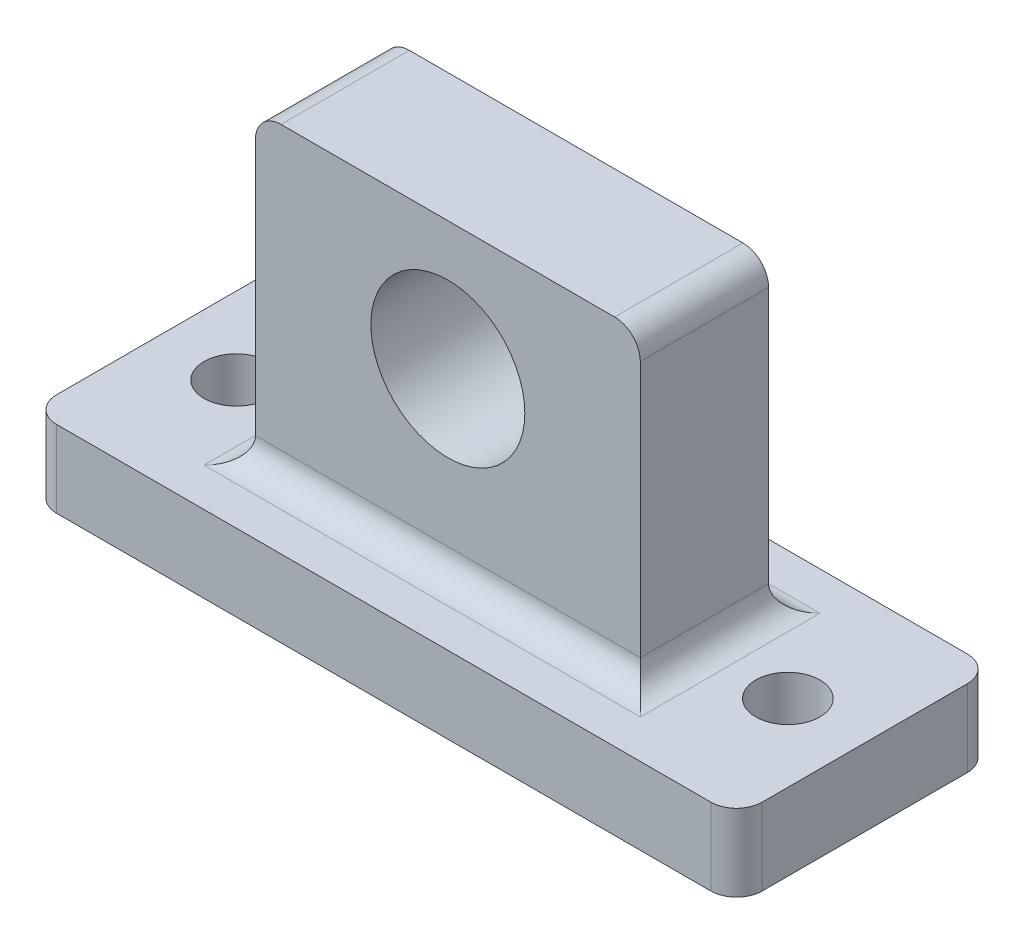
ISO-10303-21;
HEADER;
FILE_DESCRIPTION(('STEP AP214'),'2;1');
FILE_NAME('part.step','',(''),(''),'','','');
FILE_SCHEMA(('AUTOMOTIVE_DESIGN { 1 0 10303 214 1 1 1 1 }'));
ENDSEC;
DATA;
#1=APPLICATION_CONTEXT('core data for automotive mechanical design processes');
#2=APPLICATION_PROTOCOL_DEFINITION('international standard','automotive_design',2000,#1);
#3=PRODUCT_CONTEXT('',#1,'mechanical');
#4=PRODUCT('Part','Part','',(#3));
#5=PRODUCT_RELATED_PRODUCT_CATEGORY('part','',(#4));
#6=PRODUCT_DEFINITION_FORMATION('','',#4);
#7=PRODUCT_DEFINITION_CONTEXT('part definition',#1,'design');
#8=PRODUCT_DEFINITION('design','',#6,#7);
#9=PRODUCT_DEFINITION_SHAPE('','',#8);
#10=(LENGTH_UNIT() NAMED_UNIT(*) SI_UNIT(.MILLI.,.METRE.));
#11=(NAMED_UNIT(*) PLANE_ANGLE_UNIT() SI_UNIT($,.RADIAN.));
#12=(NAMED_UNIT(*) SI_UNIT($,.STERADIAN.) SOLID_ANGLE_UNIT());
#13=UNCERTAINTY_MEASURE_WITH_UNIT(LENGTH_MEASURE(1.E-05),#10,'distance_accuracy_value','');
#14=(GEOMETRIC_REPRESENTATION_CONTEXT(3) GLOBAL_UNCERTAINTY_ASSIGNED_CONTEXT((#13)) GLOBAL_UNIT_ASSIGNED_CONTEXT((#10,
#11,#12)) REPRESENTATION_CONTEXT('',''));
#15=CARTESIAN_POINT('',(0.,0.,0.));
#16=DIRECTION('',(0.,0.,1.));
#17=DIRECTION('',(1.,0.,0.));
#18=AXIS2_PLACEMENT_3D('',#15,#16,#17);
#19=CARTESIAN_POINT('',(0.,0.,10.));
#20=DIRECTION('',(0.,0.,-1.));
#21=DIRECTION('',(-1.,0.,0.));
#22=AXIS2_PLACEMENT_3D('',#19,#20,#21);
#23=PLANE('',#22);
#24=CARTESIAN_POINT('',(15.,20.,10.));
#25=DIRECTION('',(0.,0.,1.));
#26=DIRECTION('',(1.,0.,0.));
#27=AXIS2_PLACEMENT_3D('',#24,#25,#26);
#28=CIRCLE('',#27,6.);
#29=CARTESIAN_POINT('',(21.,20.,10.));
#30=VERTEX_POINT('',#29);
#31=EDGE_CURVE('E286',#30,#30,#28,.T.);
#32=ORIENTED_EDGE('',*,*,#31,.F.);
#33=EDGE_LOOP('',(#32));
#34=FACE_BOUND('',#33,.T.);
#35=DIRECTION('',(0.,-1.,0.));
#36=VECTOR('',#35,1.);
#37=CARTESIAN_POINT('',(0.,0.,10.));
#38=LINE('',#37,#36);
#39=CARTESIAN_POINT('',(0.,28.,10.));
#40=VERTEX_POINT('',#39);
#41=CARTESIAN_POINT('',(0.,8.,10.));
#42=VERTEX_POINT('',#41);
#43=EDGE_CURVE('E292',#40,#42,#38,.T.);
#44=ORIENTED_EDGE('',*,*,#43,.T.);
#45=DIRECTION('',(-1.,0.,0.));
#46=VECTOR('',#45,1.);
#47=CARTESIAN_POINT('',(30.,8.,10.));
#48=LINE('',#47,#46);
#49=CARTESIAN_POINT('',(30.,8.,10.));
#50=VERTEX_POINT('',#49);
#51=EDGE_CURVE('E203',#42,#50,#48,.F.);
#52=ORIENTED_EDGE('',*,*,#51,.T.);
#53=DIRECTION('',(0.,1.,0.));
#54=VECTOR('',#53,1.);
#55=CARTESIAN_POINT('',(30.,0.,10.));
#56=LINE('',#55,#54);
#57=CARTESIAN_POINT('',(30.,28.,10.));
#58=VERTEX_POINT('',#57);
#59=EDGE_CURVE('E181',#50,#58,#56,.T.);
#60=ORIENTED_EDGE('',*,*,#59,.T.);
#61=CARTESIAN_POINT('',(28.,28.,10.));
#62=DIRECTION('',(0.,0.,-1.));
#63=DIRECTION('',(-1.,0.,0.));
#64=AXIS2_PLACEMENT_3D('',#61,#62,#63);
#65=CIRCLE('',#64,2.);
#66=CARTESIAN_POINT('',(28.,30.,10.));
#67=VERTEX_POINT('',#66);
#68=EDGE_CURVE('E199',#58,#67,#65,.F.);
#69=ORIENTED_EDGE('',*,*,#68,.T.);
#70=DIRECTION('',(-1.,0.,0.));
#71=VECTOR('',#70,1.);
#72=CARTESIAN_POINT('',(0.,30.,10.));
#73=LINE('',#72,#71);
#74=CARTESIAN_POINT('',(2.,30.,10.));
#75=VERTEX_POINT('',#74);
#76=EDGE_CURVE('E176',#67,#75,#73,.T.);
#77=ORIENTED_EDGE('',*,*,#76,.T.);
#78=CARTESIAN_POINT('',(2.,28.,10.));
#79=DIRECTION('',(0.,0.,-1.));
#80=DIRECTION('',(-1.,0.,0.));
#81=AXIS2_PLACEMENT_3D('',#78,#79,#80);
#82=CIRCLE('',#81,2.);
#83=EDGE_CURVE('E201',#75,#40,#82,.F.);
#84=ORIENTED_EDGE('',*,*,#83,.T.);
#85=EDGE_LOOP('',(#44,#52,#60,#69,#77,#84));
#86=FACE_BOUND('',#85,.T.);
#87=ADVANCED_FACE('F34',(#34,#86),#23,.F.);
#88=CARTESIAN_POINT('',(0.,0.,0.));
#89=DIRECTION('',(0.,0.,-1.));
#90=DIRECTION('',(-1.,0.,0.));
#91=AXIS2_PLACEMENT_3D('',#88,#89,#90);
#92=PLANE('',#91);
#93=CARTESIAN_POINT('',(15.,20.,0.));
#94=DIRECTION('',(0.,0.,1.));
#95=DIRECTION('',(1.,0.,0.));
#96=AXIS2_PLACEMENT_3D('',#93,#94,#95);
#97=CIRCLE('',#96,6.);
#98=CARTESIAN_POINT('',(21.,20.,0.));
#99=VERTEX_POINT('',#98);
#100=EDGE_CURVE('E278',#99,#99,#97,.T.);
#101=ORIENTED_EDGE('',*,*,#100,.T.);
#102=EDGE_LOOP('',(#101));
#103=FACE_BOUND('',#102,.T.);
#104=DIRECTION('',(0.,1.,0.));
#105=VECTOR('',#104,1.);
#106=CARTESIAN_POINT('',(30.,0.,0.));
#107=LINE('',#106,#105);
#108=CARTESIAN_POINT('',(30.,8.,0.));
#109=VERTEX_POINT('',#108);
#110=CARTESIAN_POINT('',(30.,28.,0.));
#111=VERTEX_POINT('',#110);
#112=EDGE_CURVE('E298',#109,#111,#107,.T.);
#113=ORIENTED_EDGE('',*,*,#112,.F.);
#114=DIRECTION('',(-1.,0.,0.));
#115=VECTOR('',#114,1.);
#116=CARTESIAN_POINT('',(0.,8.,0.));
#117=LINE('',#116,#115);
#118=CARTESIAN_POINT('',(0.,8.,0.));
#119=VERTEX_POINT('',#118);
#120=EDGE_CURVE('E210',#109,#119,#117,.T.);
#121=ORIENTED_EDGE('',*,*,#120,.T.);
#122=DIRECTION('',(0.,-1.,0.));
#123=VECTOR('',#122,1.);
#124=CARTESIAN_POINT('',(0.,0.,0.));
#125=LINE('',#124,#123);
#126=CARTESIAN_POINT('',(0.,28.,0.));
#127=VERTEX_POINT('',#126);
#128=EDGE_CURVE('E289',#127,#119,#125,.T.);
#129=ORIENTED_EDGE('',*,*,#128,.F.);
#130=CARTESIAN_POINT('',(2.,28.,0.));
#131=DIRECTION('',(0.,0.,-1.));
#132=DIRECTION('',(-1.,0.,0.));
#133=AXIS2_PLACEMENT_3D('',#130,#131,#132);
#134=CIRCLE('',#133,2.);
#135=CARTESIAN_POINT('',(2.,30.,0.));
#136=VERTEX_POINT('',#135);
#137=EDGE_CURVE('E208',#127,#136,#134,.T.);
#138=ORIENTED_EDGE('',*,*,#137,.T.);
#139=DIRECTION('',(-1.,0.,0.));
#140=VECTOR('',#139,1.);
#141=CARTESIAN_POINT('',(0.,30.,0.));
#142=LINE('',#141,#140);
#143=CARTESIAN_POINT('',(28.,30.,0.));
#144=VERTEX_POINT('',#143);
#145=EDGE_CURVE('E184',#144,#136,#142,.T.);
#146=ORIENTED_EDGE('',*,*,#145,.F.);
#147=CARTESIAN_POINT('',(28.,28.,0.));
#148=DIRECTION('',(0.,0.,-1.));
#149=DIRECTION('',(-1.,0.,0.));
#150=AXIS2_PLACEMENT_3D('',#147,#148,#149);
#151=CIRCLE('',#150,2.);
#152=EDGE_CURVE('E206',#144,#111,#151,.T.);
#153=ORIENTED_EDGE('',*,*,#152,.T.);
#154=EDGE_LOOP('',(#113,#121,#129,#138,#146,#153));
#155=FACE_BOUND('',#154,.T.);
#156=ADVANCED_FACE('F331',(#103,#155),#92,.T.);
#157=CARTESIAN_POINT('',(0.,0.,10.));
#158=DIRECTION('',(1.,0.,0.));
#159=DIRECTION('',(0.,0.,-1.));
#160=AXIS2_PLACEMENT_3D('',#157,#158,#159);
#161=PLANE('',#160);
#162=ORIENTED_EDGE('',*,*,#128,.T.);
#163=DIRECTION('',(0.,0.,-1.));
#164=VECTOR('',#163,1.);
#165=CARTESIAN_POINT('',(0.,8.,10.));
#166=LINE('',#165,#164);
#167=EDGE_CURVE('E219',#119,#42,#166,.F.);
#168=ORIENTED_EDGE('',*,*,#167,.T.);
#169=ORIENTED_EDGE('',*,*,#43,.F.);
#170=DIRECTION('',(0.,0.,-1.));
#171=VECTOR('',#170,1.);
#172=CARTESIAN_POINT('',(0.,28.,10.));
#173=LINE('',#172,#171);
#174=EDGE_CURVE('E216',#40,#127,#173,.T.);
#175=ORIENTED_EDGE('',*,*,#174,.T.);
#176=EDGE_LOOP('',(#162,#168,#169,#175));
#177=FACE_BOUND('',#176,.T.);
#178=ADVANCED_FACE('F319',(#177),#161,.F.);
#179=CARTESIAN_POINT('',(30.,0.,10.));
#180=DIRECTION('',(-1.,0.,0.));
#181=DIRECTION('',(0.,0.,1.));
#182=AXIS2_PLACEMENT_3D('',#179,#180,#181);
#183=PLANE('',#182);
#184=ORIENTED_EDGE('',*,*,#59,.F.);
#185=DIRECTION('',(0.,0.,1.));
#186=VECTOR('',#185,1.);
#187=CARTESIAN_POINT('',(30.,8.,0.));
#188=LINE('',#187,#186);
#189=EDGE_CURVE('E214',#50,#109,#188,.F.);
#190=ORIENTED_EDGE('',*,*,#189,.T.);
#191=ORIENTED_EDGE('',*,*,#112,.T.);
#192=DIRECTION('',(0.,0.,-1.));
#193=VECTOR('',#192,1.);
#194=CARTESIAN_POINT('',(30.,28.,10.));
#195=LINE('',#194,#193);
#196=EDGE_CURVE('E212',#111,#58,#195,.F.);
#197=ORIENTED_EDGE('',*,*,#196,.T.);
#198=EDGE_LOOP('',(#184,#190,#191,#197));
#199=FACE_BOUND('',#198,.T.);
#200=ADVANCED_FACE('F329',(#199),#183,.F.);
#201=CARTESIAN_POINT('',(0.,30.,10.));
#202=DIRECTION('',(0.,-1.,0.));
#203=DIRECTION('',(0.,0.,-1.));
#204=AXIS2_PLACEMENT_3D('',#201,#202,#203);
#205=PLANE('',#204);
#206=ORIENTED_EDGE('',*,*,#145,.T.);
#207=DIRECTION('',(0.,0.,-1.));
#208=VECTOR('',#207,1.);
#209=CARTESIAN_POINT('',(2.,30.,10.));
#210=LINE('',#209,#208);
#211=EDGE_CURVE('E11',#136,#75,#210,.F.);
#212=ORIENTED_EDGE('',*,*,#211,.T.);
#213=ORIENTED_EDGE('',*,*,#76,.F.);
#214=DIRECTION('',(0.,0.,-1.));
#215=VECTOR('',#214,1.);
#216=CARTESIAN_POINT('',(28.,30.,10.));
#217=LINE('',#216,#215);
#218=EDGE_CURVE('E43',#67,#144,#217,.T.);
#219=ORIENTED_EDGE('',*,*,#218,.T.);
#220=EDGE_LOOP('',(#206,#212,#213,#219));
#221=FACE_BOUND('',#220,.T.);
#222=ADVANCED_FACE('F307',(#221),#205,.F.);
#223=CARTESIAN_POINT('',(15.,20.,10.));
#224=DIRECTION('',(0.,0.,-1.));
#225=DIRECTION('',(-1.,0.,0.));
#226=AXIS2_PLACEMENT_3D('',#223,#224,#225);
#227=CYLINDRICAL_SURFACE('',#226,6.);
#228=ORIENTED_EDGE('',*,*,#31,.T.);
#229=EDGE_LOOP('',(#228));
#230=FACE_BOUND('',#229,.T.);
#231=ORIENTED_EDGE('',*,*,#100,.F.);
#232=EDGE_LOOP('',(#231));
#233=FACE_BOUND('',#232,.T.);
#234=ADVANCED_FACE('F358',(#230,#233),#227,.F.);
#235=CARTESIAN_POINT('',(0.,6.,0.));
#236=DIRECTION('',(0.,-1.,0.));
#237=DIRECTION('',(0.,0.,-1.));
#238=AXIS2_PLACEMENT_3D('',#235,#236,#237);
#239=PLANE('',#238);
#240=DIRECTION('',(-1.,0.,0.));
#241=VECTOR('',#240,1.);
#242=CARTESIAN_POINT('',(0.,6.,-2.));
#243=LINE('',#242,#241);
#244=CARTESIAN_POINT('',(-2.,6.,-2.));
#245=VERTEX_POINT('',#244);
#246=CARTESIAN_POINT('',(32.,6.,-2.));
#247=VERTEX_POINT('',#246);
#248=EDGE_CURVE('E192',#245,#247,#243,.F.);
#249=ORIENTED_EDGE('',*,*,#248,.T.);
#250=DIRECTION('',(0.,0.,1.));
#251=VECTOR('',#250,1.);
#252=CARTESIAN_POINT('',(32.,6.,10.));
#253=LINE('',#252,#251);
#254=CARTESIAN_POINT('',(32.,6.,12.));
#255=VERTEX_POINT('',#254);
#256=EDGE_CURVE('E197',#247,#255,#253,.T.);
#257=ORIENTED_EDGE('',*,*,#256,.T.);
#258=DIRECTION('',(-1.,0.,0.));
#259=VECTOR('',#258,1.);
#260=CARTESIAN_POINT('',(0.,6.,12.));
#261=LINE('',#260,#259);
#262=CARTESIAN_POINT('',(-2.,6.,12.));
#263=VERTEX_POINT('',#262);
#264=EDGE_CURVE('E194',#255,#263,#261,.T.);
#265=ORIENTED_EDGE('',*,*,#264,.T.);
#266=DIRECTION('',(0.,0.,-1.));
#267=VECTOR('',#266,1.);
#268=CARTESIAN_POINT('',(-2.,6.,0.));
#269=LINE('',#268,#267);
#270=EDGE_CURVE('E190',#263,#245,#269,.T.);
#271=ORIENTED_EDGE('',*,*,#270,.T.);
#272=EDGE_LOOP('',(#249,#257,#265,#271));
#273=FACE_BOUND('',#272,.T.);
#274=CARTESIAN_POINT('',(36.5,6.,5.));
#275=DIRECTION('',(0.,-1.,0.));
#276=DIRECTION('',(0.,0.,1.));
#277=AXIS2_PLACEMENT_3D('',#274,#275,#276);
#278=CIRCLE('',#277,2.5);
#279=CARTESIAN_POINT('',(36.5,6.,7.5));
#280=VERTEX_POINT('',#279);
#281=EDGE_CURVE('E258',#280,#280,#278,.T.);
#282=ORIENTED_EDGE('',*,*,#281,.T.);
#283=EDGE_LOOP('',(#282));
#284=FACE_BOUND('',#283,.T.);
#285=CARTESIAN_POINT('',(-6.5,6.,5.));
#286=DIRECTION('',(0.,-1.,0.));
#287=DIRECTION('',(0.,0.,-1.));
#288=AXIS2_PLACEMENT_3D('',#285,#286,#287);
#289=CIRCLE('',#288,2.5);
#290=CARTESIAN_POINT('',(-6.5,6.,2.5));
#291=VERTEX_POINT('',#290);
#292=EDGE_CURVE('E266',#291,#291,#289,.T.);
#293=ORIENTED_EDGE('',*,*,#292,.T.);
#294=EDGE_LOOP('',(#293));
#295=FACE_BOUND('',#294,.T.);
#296=DIRECTION('',(0.,0.,-1.));
#297=VECTOR('',#296,1.);
#298=CARTESIAN_POINT('',(-12.5,6.,15.));
#299=LINE('',#298,#297);
#300=CARTESIAN_POINT('',(-12.5,6.,13.));
#301=VERTEX_POINT('',#300);
#302=CARTESIAN_POINT('',(-12.5,6.,-3.));
#303=VERTEX_POINT('',#302);
#304=EDGE_CURVE('E273',#301,#303,#299,.T.);
#305=ORIENTED_EDGE('',*,*,#304,.F.);
#306=CARTESIAN_POINT('',(-10.5,6.,13.));
#307=DIRECTION('',(0.,-1.,0.));
#308=DIRECTION('',(0.,0.,-1.));
#309=AXIS2_PLACEMENT_3D('',#306,#307,#308);
#310=CIRCLE('',#309,2.);
#311=CARTESIAN_POINT('',(-10.5,6.,15.));
#312=VERTEX_POINT('',#311);
#313=EDGE_CURVE('E188',#301,#312,#310,.F.);
#314=ORIENTED_EDGE('',*,*,#313,.T.);
#315=DIRECTION('',(-1.,0.,0.));
#316=VECTOR('',#315,1.);
#317=CARTESIAN_POINT('',(-12.5,6.,15.));
#318=LINE('',#317,#316);
#319=CARTESIAN_POINT('',(40.5,6.,15.));
#320=VERTEX_POINT('',#319);
#321=EDGE_CURVE('E171',#320,#312,#318,.T.);
#322=ORIENTED_EDGE('',*,*,#321,.F.);
#323=CARTESIAN_POINT('',(40.5,6.,13.));
#324=DIRECTION('',(0.,-1.,0.));
#325=DIRECTION('',(0.,0.,-1.));
#326=AXIS2_PLACEMENT_3D('',#323,#324,#325);
#327=CIRCLE('',#326,2.);
#328=CARTESIAN_POINT('',(42.5,6.,13.));
#329=VERTEX_POINT('',#328);
#330=EDGE_CURVE('E170',#320,#329,#327,.F.);
#331=ORIENTED_EDGE('',*,*,#330,.T.);
#332=DIRECTION('',(0.,0.,1.));
#333=VECTOR('',#332,1.);
#334=CARTESIAN_POINT('',(42.5,6.,15.));
#335=LINE('',#334,#333);
#336=CARTESIAN_POINT('',(42.5,6.,-2.99999999999999));
#337=VERTEX_POINT('',#336);
#338=EDGE_CURVE('E154',#337,#329,#335,.T.);
#339=ORIENTED_EDGE('',*,*,#338,.F.);
#340=CARTESIAN_POINT('',(40.5,6.,-2.99999999999999));
#341=DIRECTION('',(0.,-1.,0.));
#342=DIRECTION('',(0.,0.,-1.));
#343=AXIS2_PLACEMENT_3D('',#340,#341,#342);
#344=CIRCLE('',#343,2.);
#345=CARTESIAN_POINT('',(40.5,6.,-4.99999999999999));
#346=VERTEX_POINT('',#345);
#347=EDGE_CURVE('E166',#337,#346,#344,.F.);
#348=ORIENTED_EDGE('',*,*,#347,.T.);
#349=DIRECTION('',(1.,0.,0.));
#350=VECTOR('',#349,1.);
#351=CARTESIAN_POINT('',(-12.5,6.,-5.));
#352=LINE('',#351,#350);
#353=CARTESIAN_POINT('',(-10.5,6.,-5.));
#354=VERTEX_POINT('',#353);
#355=EDGE_CURVE('E276',#354,#346,#352,.T.);
#356=ORIENTED_EDGE('',*,*,#355,.F.);
#357=CARTESIAN_POINT('',(-10.5,6.,-3.));
#358=DIRECTION('',(0.,-1.,0.));
#359=DIRECTION('',(0.,0.,-1.));
#360=AXIS2_PLACEMENT_3D('',#357,#358,#359);
#361=CIRCLE('',#360,2.);
#362=EDGE_CURVE('E178',#354,#303,#361,.F.);
#363=ORIENTED_EDGE('',*,*,#362,.T.);
#364=EDGE_LOOP('',(#305,#314,#322,#331,#339,#348,#356,#363));
#365=FACE_BOUND('',#364,.T.);
#366=ADVANCED_FACE('F164',(#273,#284,#295,#365),#239,.F.);
#367=CARTESIAN_POINT('',(42.5,6.,15.));
#368=DIRECTION('',(1.,0.,0.));
#369=DIRECTION('',(0.,0.,-1.));
#370=AXIS2_PLACEMENT_3D('',#367,#368,#369);
#371=PLANE('',#370);
#372=ORIENTED_EDGE('',*,*,#338,.T.);
#373=DIRECTION('',(0.,-1.,0.));
#374=VECTOR('',#373,1.);
#375=CARTESIAN_POINT('',(42.5,6.,13.));
#376=LINE('',#375,#374);
#377=CARTESIAN_POINT('',(42.5,0.,13.));
#378=VERTEX_POINT('',#377);
#379=EDGE_CURVE('E159',#329,#378,#376,.T.);
#380=ORIENTED_EDGE('',*,*,#379,.T.);
#381=DIRECTION('',(0.,0.,1.));
#382=VECTOR('',#381,1.);
#383=CARTESIAN_POINT('',(42.5,0.,15.));
#384=LINE('',#383,#382);
#385=CARTESIAN_POINT('',(42.5,0.,-2.99999999999999));
#386=VERTEX_POINT('',#385);
#387=EDGE_CURVE('E157',#386,#378,#384,.T.);
#388=ORIENTED_EDGE('',*,*,#387,.F.);
#389=DIRECTION('',(0.,-1.,0.));
#390=VECTOR('',#389,1.);
#391=CARTESIAN_POINT('',(42.5,6.,-2.99999999999999));
#392=LINE('',#391,#390);
#393=EDGE_CURVE('E150',#386,#337,#392,.F.);
#394=ORIENTED_EDGE('',*,*,#393,.T.);
#395=EDGE_LOOP('',(#372,#380,#388,#394));
#396=FACE_BOUND('',#395,.T.);
#397=ADVANCED_FACE('F152',(#396),#371,.T.);
#398=CARTESIAN_POINT('',(-12.5,6.,-5.));
#399=DIRECTION('',(0.,0.,-1.));
#400=DIRECTION('',(-1.,0.,0.));
#401=AXIS2_PLACEMENT_3D('',#398,#399,#400);
#402=PLANE('',#401);
#403=DIRECTION('',(1.,0.,0.));
#404=VECTOR('',#403,1.);
#405=CARTESIAN_POINT('',(-12.5,0.,-5.));
#406=LINE('',#405,#404);
#407=CARTESIAN_POINT('',(-10.5,0.,-5.));
#408=VERTEX_POINT('',#407);
#409=CARTESIAN_POINT('',(40.5,0.,-4.99999999999999));
#410=VERTEX_POINT('',#409);
#411=EDGE_CURVE('E172',#408,#410,#406,.T.);
#412=ORIENTED_EDGE('',*,*,#411,.F.);
#413=DIRECTION('',(0.,-1.,0.));
#414=VECTOR('',#413,1.);
#415=CARTESIAN_POINT('',(-10.5,6.,-5.));
#416=LINE('',#415,#414);
#417=EDGE_CURVE('E160',#408,#354,#416,.F.);
#418=ORIENTED_EDGE('',*,*,#417,.T.);
#419=ORIENTED_EDGE('',*,*,#355,.T.);
#420=DIRECTION('',(0.,-1.,0.));
#421=VECTOR('',#420,1.);
#422=CARTESIAN_POINT('',(40.5,6.,-4.99999999999999));
#423=LINE('',#422,#421);
#424=EDGE_CURVE('E175',#346,#410,#423,.T.);
#425=ORIENTED_EDGE('',*,*,#424,.T.);
#426=EDGE_LOOP('',(#412,#418,#419,#425));
#427=FACE_BOUND('',#426,.T.);
#428=ADVANCED_FACE('F474',(#427),#402,.T.);
#429=CARTESIAN_POINT('',(-12.5,6.,15.));
#430=DIRECTION('',(-1.,0.,0.));
#431=DIRECTION('',(0.,0.,1.));
#432=AXIS2_PLACEMENT_3D('',#429,#430,#431);
#433=PLANE('',#432);
#434=DIRECTION('',(0.,0.,-1.));
#435=VECTOR('',#434,1.);
#436=CARTESIAN_POINT('',(-12.5,0.,15.));
#437=LINE('',#436,#435);
#438=CARTESIAN_POINT('',(-12.5,0.,13.));
#439=VERTEX_POINT('',#438);
#440=CARTESIAN_POINT('',(-12.5,0.,-3.));
#441=VERTEX_POINT('',#440);
#442=EDGE_CURVE('E283',#439,#441,#437,.T.);
#443=ORIENTED_EDGE('',*,*,#442,.F.);
#444=DIRECTION('',(0.,-1.,0.));
#445=VECTOR('',#444,1.);
#446=CARTESIAN_POINT('',(-12.5,6.,13.));
#447=LINE('',#446,#445);
#448=EDGE_CURVE('E235',#439,#301,#447,.F.);
#449=ORIENTED_EDGE('',*,*,#448,.T.);
#450=ORIENTED_EDGE('',*,*,#304,.T.);
#451=DIRECTION('',(0.,-1.,0.));
#452=VECTOR('',#451,1.);
#453=CARTESIAN_POINT('',(-12.5,6.,-3.));
#454=LINE('',#453,#452);
#455=EDGE_CURVE('E232',#303,#441,#454,.T.);
#456=ORIENTED_EDGE('',*,*,#455,.T.);
#457=EDGE_LOOP('',(#443,#449,#450,#456));
#458=FACE_BOUND('',#457,.T.);
#459=ADVANCED_FACE('F462',(#458),#433,.T.);
#460=CARTESIAN_POINT('',(-12.5,6.,15.));
#461=DIRECTION('',(0.,0.,1.));
#462=DIRECTION('',(1.,0.,0.));
#463=AXIS2_PLACEMENT_3D('',#460,#461,#462);
#464=PLANE('',#463);
#465=ORIENTED_EDGE('',*,*,#321,.T.);
#466=DIRECTION('',(0.,-1.,0.));
#467=VECTOR('',#466,1.);
#468=CARTESIAN_POINT('',(-10.5,6.,15.));
#469=LINE('',#468,#467);
#470=CARTESIAN_POINT('',(-10.5,0.,15.));
#471=VERTEX_POINT('',#470);
#472=EDGE_CURVE('E223',#312,#471,#469,.T.);
#473=ORIENTED_EDGE('',*,*,#472,.T.);
#474=DIRECTION('',(-1.,0.,0.));
#475=VECTOR('',#474,1.);
#476=CARTESIAN_POINT('',(-12.5,0.,15.));
#477=LINE('',#476,#475);
#478=CARTESIAN_POINT('',(40.5,0.,15.));
#479=VERTEX_POINT('',#478);
#480=EDGE_CURVE('E280',#479,#471,#477,.T.);
#481=ORIENTED_EDGE('',*,*,#480,.F.);
#482=DIRECTION('',(0.,-1.,0.));
#483=VECTOR('',#482,1.);
#484=CARTESIAN_POINT('',(40.5,6.,15.));
#485=LINE('',#484,#483);
#486=EDGE_CURVE('E221',#479,#320,#485,.F.);
#487=ORIENTED_EDGE('',*,*,#486,.T.);
#488=EDGE_LOOP('',(#465,#473,#481,#487));
#489=FACE_BOUND('',#488,.T.);
#490=ADVANCED_FACE('F456',(#489),#464,.T.);
#491=CARTESIAN_POINT('',(-6.5,6.,5.));
#492=DIRECTION('',(0.,-1.,0.));
#493=DIRECTION('',(0.,0.,-1.));
#494=AXIS2_PLACEMENT_3D('',#491,#492,#493);
#495=CYLINDRICAL_SURFACE('',#494,2.5);
#496=ORIENTED_EDGE('',*,*,#292,.F.);
#497=EDGE_LOOP('',(#496));
#498=FACE_BOUND('',#497,.T.);
#499=CARTESIAN_POINT('',(-6.5,0.,5.));
#500=DIRECTION('',(0.,-1.,0.));
#501=DIRECTION('',(0.,0.,-1.));
#502=AXIS2_PLACEMENT_3D('',#499,#500,#501);
#503=CIRCLE('',#502,2.5);
#504=CARTESIAN_POINT('',(-6.5,0.,2.5));
#505=VERTEX_POINT('',#504);
#506=EDGE_CURVE('E263',#505,#505,#503,.T.);
#507=ORIENTED_EDGE('',*,*,#506,.T.);
#508=EDGE_LOOP('',(#507));
#509=FACE_BOUND('',#508,.T.);
#510=ADVANCED_FACE('F461',(#498,#509),#495,.F.);
#511=CARTESIAN_POINT('',(36.5,6.,5.));
#512=DIRECTION('',(0.,-1.,0.));
#513=DIRECTION('',(0.,0.,-1.));
#514=AXIS2_PLACEMENT_3D('',#511,#512,#513);
#515=CYLINDRICAL_SURFACE('',#514,2.5);
#516=ORIENTED_EDGE('',*,*,#281,.F.);
#517=EDGE_LOOP('',(#516));
#518=FACE_BOUND('',#517,.T.);
#519=CARTESIAN_POINT('',(36.5,0.,5.));
#520=DIRECTION('',(0.,-1.,0.));
#521=DIRECTION('',(0.,0.,1.));
#522=AXIS2_PLACEMENT_3D('',#519,#520,#521);
#523=CIRCLE('',#522,2.5);
#524=CARTESIAN_POINT('',(36.5,0.,7.5));
#525=VERTEX_POINT('',#524);
#526=EDGE_CURVE('E252',#525,#525,#523,.T.);
#527=ORIENTED_EDGE('',*,*,#526,.T.);
#528=EDGE_LOOP('',(#527));
#529=FACE_BOUND('',#528,.T.);
#530=ADVANCED_FACE('F367',(#518,#529),#515,.F.);
#531=CARTESIAN_POINT('',(0.,0.,10.));
#532=DIRECTION('',(0.,1.,0.));
#533=DIRECTION('',(0.,0.,1.));
#534=AXIS2_PLACEMENT_3D('',#531,#532,#533);
#535=PLANE('',#534);
#536=ORIENTED_EDGE('',*,*,#480,.T.);
#537=CARTESIAN_POINT('',(-10.5,0.,13.));
#538=DIRECTION('',(0.,1.,0.));
#539=DIRECTION('',(0.,0.,1.));
#540=AXIS2_PLACEMENT_3D('',#537,#538,#539);
#541=CIRCLE('',#540,2.);
#542=EDGE_CURVE('E230',#471,#439,#541,.F.);
#543=ORIENTED_EDGE('',*,*,#542,.T.);
#544=ORIENTED_EDGE('',*,*,#442,.T.);
#545=CARTESIAN_POINT('',(-10.5,0.,-3.));
#546=DIRECTION('',(0.,1.,0.));
#547=DIRECTION('',(0.,0.,1.));
#548=AXIS2_PLACEMENT_3D('',#545,#546,#547);
#549=CIRCLE('',#548,2.);
#550=EDGE_CURVE('E59',#441,#408,#549,.F.);
#551=ORIENTED_EDGE('',*,*,#550,.T.);
#552=ORIENTED_EDGE('',*,*,#411,.T.);
#553=CARTESIAN_POINT('',(40.5,0.,-2.99999999999999));
#554=DIRECTION('',(0.,1.,0.));
#555=DIRECTION('',(0.,0.,1.));
#556=AXIS2_PLACEMENT_3D('',#553,#554,#555);
#557=CIRCLE('',#556,2.);
#558=EDGE_CURVE('E51',#410,#386,#557,.F.);
#559=ORIENTED_EDGE('',*,*,#558,.T.);
#560=ORIENTED_EDGE('',*,*,#387,.T.);
#561=CARTESIAN_POINT('',(40.5,0.,13.));
#562=DIRECTION('',(0.,1.,0.));
#563=DIRECTION('',(0.,0.,1.));
#564=AXIS2_PLACEMENT_3D('',#561,#562,#563);
#565=CIRCLE('',#564,2.);
#566=EDGE_CURVE('E227',#378,#479,#565,.F.);
#567=ORIENTED_EDGE('',*,*,#566,.T.);
#568=EDGE_LOOP('',(#536,#543,#544,#551,#552,#559,#560,#567));
#569=FACE_BOUND('',#568,.T.);
#570=ORIENTED_EDGE('',*,*,#506,.F.);
#571=EDGE_LOOP('',(#570));
#572=FACE_BOUND('',#571,.T.);
#573=ORIENTED_EDGE('',*,*,#526,.F.);
#574=EDGE_LOOP('',(#573));
#575=FACE_BOUND('',#574,.T.);
#576=ADVANCED_FACE('F346',(#569,#572,#575),#535,.F.);
#577=CARTESIAN_POINT('',(0.,8.,-2.));
#578=DIRECTION('',(-1.,0.,0.));
#579=DIRECTION('',(0.,0.,1.));
#580=AXIS2_PLACEMENT_3D('',#577,#578,#579);
#581=CYLINDRICAL_SURFACE('',#580,2.);
#582=CARTESIAN_POINT('',(-2.,8.,-2.));
#583=DIRECTION('',(-0.707106781186547,0.,0.707106781186547));
#584=DIRECTION('',(0.707106781186547,0.,0.707106781186547));
#585=AXIS2_PLACEMENT_3D('',#582,#583,#584);
#586=ELLIPSE('',#585,2.82842712474619,2.);
#587=EDGE_CURVE('E245',#119,#245,#586,.F.);
#588=ORIENTED_EDGE('',*,*,#587,.F.);
#589=ORIENTED_EDGE('',*,*,#120,.F.);
#590=CARTESIAN_POINT('',(32.,8.,-2.));
#591=DIRECTION('',(-0.707106781186547,0.,-0.707106781186547));
#592=DIRECTION('',(0.707106781186547,0.,-0.707106781186547));
#593=AXIS2_PLACEMENT_3D('',#590,#591,#592);
#594=ELLIPSE('',#593,2.82842712474619,2.);
#595=EDGE_CURVE('E38',#247,#109,#594,.T.);
#596=ORIENTED_EDGE('',*,*,#595,.F.);
#597=ORIENTED_EDGE('',*,*,#248,.F.);
#598=EDGE_LOOP('',(#588,#589,#596,#597));
#599=FACE_BOUND('',#598,.T.);
#600=ADVANCED_FACE('F334',(#599),#581,.F.);
#601=CARTESIAN_POINT('',(32.,8.,0.));
#602=DIRECTION('',(0.,0.,-1.));
#603=DIRECTION('',(-1.,0.,0.));
#604=AXIS2_PLACEMENT_3D('',#601,#602,#603);
#605=CYLINDRICAL_SURFACE('',#604,2.);
#606=ORIENTED_EDGE('',*,*,#595,.T.);
#607=ORIENTED_EDGE('',*,*,#189,.F.);
#608=CARTESIAN_POINT('',(32.,8.,12.));
#609=DIRECTION('',(0.707106781186547,0.,-0.707106781186547));
#610=DIRECTION('',(-0.707106781186547,0.,-0.707106781186547));
#611=AXIS2_PLACEMENT_3D('',#608,#609,#610);
#612=ELLIPSE('',#611,2.82842712474619,2.);
#613=EDGE_CURVE('E244',#255,#50,#612,.T.);
#614=ORIENTED_EDGE('',*,*,#613,.F.);
#615=ORIENTED_EDGE('',*,*,#256,.F.);
#616=EDGE_LOOP('',(#606,#607,#614,#615));
#617=FACE_BOUND('',#616,.T.);
#618=ADVANCED_FACE('F338',(#617),#605,.F.);
#619=CARTESIAN_POINT('',(-2.,8.,0.));
#620=DIRECTION('',(0.,0.,1.));
#621=DIRECTION('',(1.,0.,0.));
#622=AXIS2_PLACEMENT_3D('',#619,#620,#621);
#623=CYLINDRICAL_SURFACE('',#622,2.);
#624=ORIENTED_EDGE('',*,*,#587,.T.);
#625=ORIENTED_EDGE('',*,*,#270,.F.);
#626=CARTESIAN_POINT('',(-2.,8.,12.));
#627=DIRECTION('',(0.707106781186547,0.,0.707106781186547));
#628=DIRECTION('',(-0.707106781186547,0.,0.707106781186547));
#629=AXIS2_PLACEMENT_3D('',#626,#627,#628);
#630=ELLIPSE('',#629,2.82842712474619,2.);
#631=EDGE_CURVE('E242',#42,#263,#630,.F.);
#632=ORIENTED_EDGE('',*,*,#631,.F.);
#633=ORIENTED_EDGE('',*,*,#167,.F.);
#634=EDGE_LOOP('',(#624,#625,#632,#633));
#635=FACE_BOUND('',#634,.T.);
#636=ADVANCED_FACE('F322',(#635),#623,.F.);
#637=CARTESIAN_POINT('',(0.,8.,12.));
#638=DIRECTION('',(1.,0.,0.));
#639=DIRECTION('',(0.,0.,-1.));
#640=AXIS2_PLACEMENT_3D('',#637,#638,#639);
#641=CYLINDRICAL_SURFACE('',#640,2.);
#642=ORIENTED_EDGE('',*,*,#613,.T.);
#643=ORIENTED_EDGE('',*,*,#51,.F.);
#644=ORIENTED_EDGE('',*,*,#631,.T.);
#645=ORIENTED_EDGE('',*,*,#264,.F.);
#646=EDGE_LOOP('',(#642,#643,#644,#645));
#647=FACE_BOUND('',#646,.T.);
#648=ADVANCED_FACE('F325',(#647),#641,.F.);
#649=CARTESIAN_POINT('',(-10.5,6.,13.));
#650=DIRECTION('',(0.,-1.,0.));
#651=DIRECTION('',(0.,0.,-1.));
#652=AXIS2_PLACEMENT_3D('',#649,#650,#651);
#653=CYLINDRICAL_SURFACE('',#652,2.);
#654=ORIENTED_EDGE('',*,*,#313,.F.);
#655=ORIENTED_EDGE('',*,*,#448,.F.);
#656=ORIENTED_EDGE('',*,*,#542,.F.);
#657=ORIENTED_EDGE('',*,*,#472,.F.);
#658=EDGE_LOOP('',(#654,#655,#656,#657));
#659=FACE_BOUND('',#658,.T.);
#660=ADVANCED_FACE('F371',(#659),#653,.T.);
#661=CARTESIAN_POINT('',(-10.5,6.,-3.));
#662=DIRECTION('',(0.,-1.,0.));
#663=DIRECTION('',(0.,0.,-1.));
#664=AXIS2_PLACEMENT_3D('',#661,#662,#663);
#665=CYLINDRICAL_SURFACE('',#664,2.);
#666=ORIENTED_EDGE('',*,*,#362,.F.);
#667=ORIENTED_EDGE('',*,*,#417,.F.);
#668=ORIENTED_EDGE('',*,*,#550,.F.);
#669=ORIENTED_EDGE('',*,*,#455,.F.);
#670=EDGE_LOOP('',(#666,#667,#668,#669));
#671=FACE_BOUND('',#670,.T.);
#672=ADVANCED_FACE('F375',(#671),#665,.T.);
#673=CARTESIAN_POINT('',(40.5,6.,13.));
#674=DIRECTION('',(0.,-1.,0.));
#675=DIRECTION('',(0.,0.,-1.));
#676=AXIS2_PLACEMENT_3D('',#673,#674,#675);
#677=CYLINDRICAL_SURFACE('',#676,2.);
#678=ORIENTED_EDGE('',*,*,#330,.F.);
#679=ORIENTED_EDGE('',*,*,#486,.F.);
#680=ORIENTED_EDGE('',*,*,#566,.F.);
#681=ORIENTED_EDGE('',*,*,#379,.F.);
#682=EDGE_LOOP('',(#678,#679,#680,#681));
#683=FACE_BOUND('',#682,.T.);
#684=ADVANCED_FACE('F381',(#683),#677,.T.);
#685=CARTESIAN_POINT('',(40.5,6.,-2.99999999999999));
#686=DIRECTION('',(0.,-1.,0.));
#687=DIRECTION('',(0.,0.,-1.));
#688=AXIS2_PLACEMENT_3D('',#685,#686,#687);
#689=CYLINDRICAL_SURFACE('',#688,2.);
#690=ORIENTED_EDGE('',*,*,#347,.F.);
#691=ORIENTED_EDGE('',*,*,#393,.F.);
#692=ORIENTED_EDGE('',*,*,#558,.F.);
#693=ORIENTED_EDGE('',*,*,#424,.F.);
#694=EDGE_LOOP('',(#690,#691,#692,#693));
#695=FACE_BOUND('',#694,.T.);
#696=ADVANCED_FACE('F174',(#695),#689,.T.);
#697=CARTESIAN_POINT('',(2.,28.,10.));
#698=DIRECTION('',(0.,0.,-1.));
#699=DIRECTION('',(-1.,0.,0.));
#700=AXIS2_PLACEMENT_3D('',#697,#698,#699);
#701=CYLINDRICAL_SURFACE('',#700,2.);
#702=ORIENTED_EDGE('',*,*,#83,.F.);
#703=ORIENTED_EDGE('',*,*,#211,.F.);
#704=ORIENTED_EDGE('',*,*,#137,.F.);
#705=ORIENTED_EDGE('',*,*,#174,.F.);
#706=EDGE_LOOP('',(#702,#703,#704,#705));
#707=FACE_BOUND('',#706,.T.);
#708=ADVANCED_FACE('F313',(#707),#701,.T.);
#709=CARTESIAN_POINT('',(28.,28.,10.));
#710=DIRECTION('',(0.,0.,-1.));
#711=DIRECTION('',(-1.,0.,0.));
#712=AXIS2_PLACEMENT_3D('',#709,#710,#711);
#713=CYLINDRICAL_SURFACE('',#712,2.);
#714=ORIENTED_EDGE('',*,*,#68,.F.);
#715=ORIENTED_EDGE('',*,*,#196,.F.);
#716=ORIENTED_EDGE('',*,*,#152,.F.);
#717=ORIENTED_EDGE('',*,*,#218,.F.);
#718=EDGE_LOOP('',(#714,#715,#716,#717));
#719=FACE_BOUND('',#718,.T.);
#720=ADVANCED_FACE('F36',(#719),#713,.T.);
#721=CLOSED_SHELL('',(#87,#156,#178,#200,#222,#234,#366,#397,#428,#459,#490,#510,#530,#576,#600,
#618,#636,#648,#660,#672,#684,#696,#708,#720));
#722=MANIFOLD_SOLID_BREP('B2',#721);
#723=ADVANCED_BREP_SHAPE_REPRESENTATION('',(#18,#722),#14);
#724=SHAPE_DEFINITION_REPRESENTATION(#9,#723);
ENDSEC;
END-ISO-10303-21;
